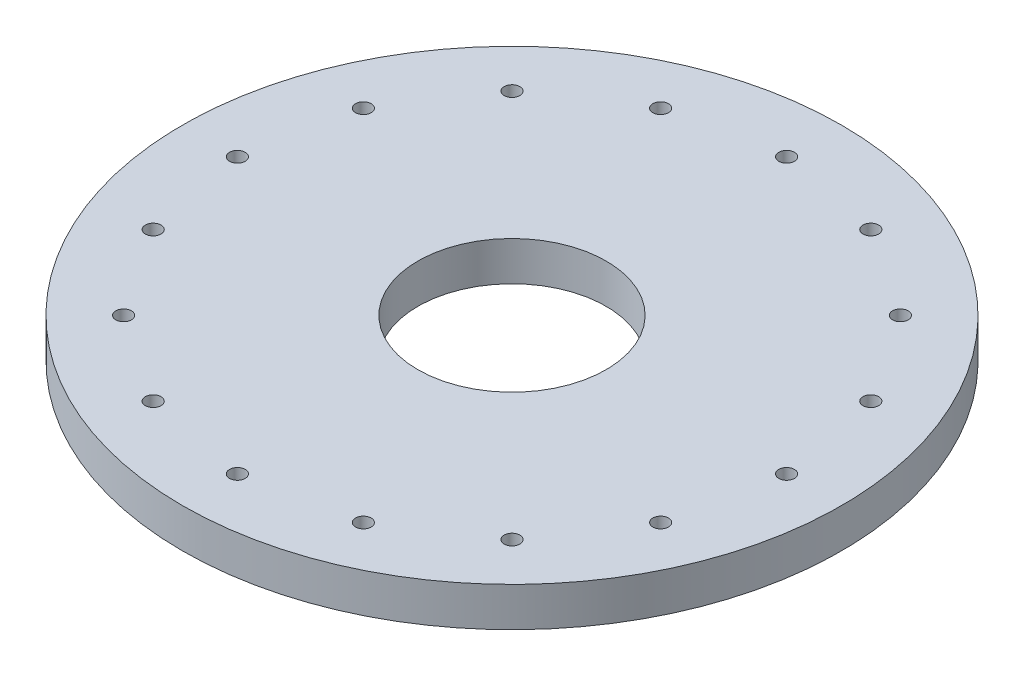
ISO-10303-21;
HEADER;
FILE_DESCRIPTION(('STEP AP214'),'2;1');
FILE_NAME('part.step','',(''),(''),'','','');
FILE_SCHEMA(('AUTOMOTIVE_DESIGN { 1 0 10303 214 1 1 1 1 }'));
ENDSEC;
DATA;
#1=APPLICATION_CONTEXT('core data for automotive mechanical design processes');
#2=APPLICATION_PROTOCOL_DEFINITION('international standard','automotive_design',2000,#1);
#3=PRODUCT_CONTEXT('',#1,'mechanical');
#4=PRODUCT('Part','Part','',(#3));
#5=PRODUCT_RELATED_PRODUCT_CATEGORY('part','',(#4));
#6=PRODUCT_DEFINITION_FORMATION('','',#4);
#7=PRODUCT_DEFINITION_CONTEXT('part definition',#1,'design');
#8=PRODUCT_DEFINITION('design','',#6,#7);
#9=PRODUCT_DEFINITION_SHAPE('','',#8);
#10=(LENGTH_UNIT() NAMED_UNIT(*) SI_UNIT(.MILLI.,.METRE.));
#11=(NAMED_UNIT(*) PLANE_ANGLE_UNIT() SI_UNIT($,.RADIAN.));
#12=(NAMED_UNIT(*) SI_UNIT($,.STERADIAN.) SOLID_ANGLE_UNIT());
#13=UNCERTAINTY_MEASURE_WITH_UNIT(LENGTH_MEASURE(1.E-05),#10,'distance_accuracy_value','');
#14=(GEOMETRIC_REPRESENTATION_CONTEXT(3) GLOBAL_UNCERTAINTY_ASSIGNED_CONTEXT((#13)) GLOBAL_UNIT_ASSIGNED_CONTEXT((#10,
#11,#12)) REPRESENTATION_CONTEXT('',''));
#15=CARTESIAN_POINT('',(0.,0.,0.));
#16=DIRECTION('',(0.,0.,1.));
#17=DIRECTION('',(1.,0.,0.));
#18=AXIS2_PLACEMENT_3D('',#15,#16,#17);
#19=CARTESIAN_POINT('',(0.,5.,0.));
#20=DIRECTION('',(0.,1.,0.));
#21=DIRECTION('',(0.,0.,1.));
#22=AXIS2_PLACEMENT_3D('',#19,#20,#21);
#23=PLANE('',#22);
#24=CARTESIAN_POINT('',(24.7487373415295,5.,-24.7487373415289));
#25=DIRECTION('',(0.,1.,0.));
#26=DIRECTION('',(0.,0.,1.));
#27=AXIS2_PLACEMENT_3D('',#24,#25,#26);
#28=CIRCLE('',#27,1.);
#29=CARTESIAN_POINT('',(24.7487373415295,5.,-23.7487373415289));
#30=VERTEX_POINT('',#29);
#31=EDGE_CURVE('E135',#30,#30,#28,.T.);
#32=ORIENTED_EDGE('',*,*,#31,.F.);
#33=EDGE_LOOP('',(#32));
#34=FACE_BOUND('',#33,.T.);
#35=CARTESIAN_POINT('',(3.66605540578529E-13,5.,-35.));
#36=DIRECTION('',(0.,1.,0.));
#37=DIRECTION('',(0.,0.,1.));
#38=AXIS2_PLACEMENT_3D('',#35,#36,#37);
#39=CIRCLE('',#38,0.999999999999995);
#40=CARTESIAN_POINT('',(3.66605540578529E-13,5.,-34.));
#41=VERTEX_POINT('',#40);
#42=EDGE_CURVE('E123',#41,#41,#39,.T.);
#43=ORIENTED_EDGE('',*,*,#42,.F.);
#44=EDGE_LOOP('',(#43));
#45=FACE_BOUND('',#44,.T.);
#46=CARTESIAN_POINT('',(-24.748737341529,5.,-24.7487373415294));
#47=DIRECTION('',(0.,1.,0.));
#48=DIRECTION('',(0.,0.,1.));
#49=AXIS2_PLACEMENT_3D('',#46,#47,#48);
#50=CIRCLE('',#49,1.);
#51=CARTESIAN_POINT('',(-24.748737341529,5.,-23.7487373415294));
#52=VERTEX_POINT('',#51);
#53=EDGE_CURVE('E111',#52,#52,#50,.T.);
#54=ORIENTED_EDGE('',*,*,#53,.F.);
#55=EDGE_LOOP('',(#54));
#56=FACE_BOUND('',#55,.T.);
#57=CARTESIAN_POINT('',(-35.,5.,-2.44403693719019E-13));
#58=DIRECTION('',(0.,1.,0.));
#59=DIRECTION('',(0.,0.,1.));
#60=AXIS2_PLACEMENT_3D('',#57,#58,#59);
#61=CIRCLE('',#60,0.999999999999996);
#62=CARTESIAN_POINT('',(-35.,5.,0.999999999999752));
#63=VERTEX_POINT('',#62);
#64=EDGE_CURVE('E99',#63,#63,#61,.T.);
#65=ORIENTED_EDGE('',*,*,#64,.F.);
#66=EDGE_LOOP('',(#65));
#67=FACE_BOUND('',#66,.T.);
#68=CARTESIAN_POINT('',(-24.7487373415293,5.,24.748737341529));
#69=DIRECTION('',(0.,1.,0.));
#70=DIRECTION('',(0.,0.,1.));
#71=AXIS2_PLACEMENT_3D('',#68,#69,#70);
#72=CIRCLE('',#71,0.999999999999994);
#73=CARTESIAN_POINT('',(-24.7487373415293,5.,25.748737341529));
#74=VERTEX_POINT('',#73);
#75=EDGE_CURVE('E87',#74,#74,#72,.T.);
#76=ORIENTED_EDGE('',*,*,#75,.F.);
#77=EDGE_LOOP('',(#76));
#78=FACE_BOUND('',#77,.T.);
#79=CARTESIAN_POINT('',(-1.2220184685951E-13,5.,35.));
#80=DIRECTION('',(0.,1.,0.));
#81=DIRECTION('',(0.,0.,1.));
#82=AXIS2_PLACEMENT_3D('',#79,#80,#81);
#83=CIRCLE('',#82,0.999999999999997);
#84=CARTESIAN_POINT('',(-1.2220184685951E-13,5.,36.));
#85=VERTEX_POINT('',#84);
#86=EDGE_CURVE('E75',#85,#85,#83,.T.);
#87=ORIENTED_EDGE('',*,*,#86,.F.);
#88=EDGE_LOOP('',(#87));
#89=FACE_BOUND('',#88,.T.);
#90=CARTESIAN_POINT('',(24.7487373415291,5.,24.7487373415292));
#91=DIRECTION('',(0.,1.,0.));
#92=DIRECTION('',(0.,0.,1.));
#93=AXIS2_PLACEMENT_3D('',#90,#91,#92);
#94=CIRCLE('',#93,0.999999999999997);
#95=CARTESIAN_POINT('',(24.7487373415291,5.,25.7487373415292));
#96=VERTEX_POINT('',#95);
#97=EDGE_CURVE('E63',#96,#96,#94,.T.);
#98=ORIENTED_EDGE('',*,*,#97,.F.);
#99=EDGE_LOOP('',(#98));
#100=FACE_BOUND('',#99,.T.);
#101=CARTESIAN_POINT('',(35.,5.,0.));
#102=DIRECTION('',(0.,1.,0.));
#103=DIRECTION('',(0.,0.,1.));
#104=AXIS2_PLACEMENT_3D('',#101,#102,#103);
#105=CIRCLE('',#104,0.999999999999998);
#106=CARTESIAN_POINT('',(35.,5.,0.999999999999998));
#107=VERTEX_POINT('',#106);
#108=EDGE_CURVE('E51',#107,#107,#105,.T.);
#109=ORIENTED_EDGE('',*,*,#108,.F.);
#110=EDGE_LOOP('',(#109));
#111=FACE_BOUND('',#110,.T.);
#112=CARTESIAN_POINT('',(0.,5.,0.));
#113=DIRECTION('',(0.,1.,0.));
#114=DIRECTION('',(0.,0.,1.));
#115=AXIS2_PLACEMENT_3D('',#112,#113,#114);
#116=CIRCLE('',#115,42.);
#117=CARTESIAN_POINT('',(0.,5.,42.));
#118=VERTEX_POINT('',#117);
#119=EDGE_CURVE('E10',#118,#118,#116,.T.);
#120=ORIENTED_EDGE('',*,*,#119,.T.);
#121=EDGE_LOOP('',(#120));
#122=FACE_BOUND('',#121,.T.);
#123=CARTESIAN_POINT('',(0.,5.,0.));
#124=DIRECTION('',(0.,1.,0.));
#125=DIRECTION('',(0.,0.,1.));
#126=AXIS2_PLACEMENT_3D('',#123,#124,#125);
#127=CIRCLE('',#126,12.);
#128=CARTESIAN_POINT('',(0.,5.,12.));
#129=VERTEX_POINT('',#128);
#130=EDGE_CURVE('E46',#129,#129,#127,.T.);
#131=ORIENTED_EDGE('',*,*,#130,.F.);
#132=EDGE_LOOP('',(#131));
#133=FACE_BOUND('',#132,.T.);
#134=CARTESIAN_POINT('',(32.335783637895,5.,13.3939201327782));
#135=DIRECTION('',(0.,1.,0.));
#136=DIRECTION('',(0.,0.,1.));
#137=AXIS2_PLACEMENT_3D('',#134,#135,#136);
#138=CIRCLE('',#137,0.999999999999994);
#139=CARTESIAN_POINT('',(32.335783637895,5.,14.3939201327782));
#140=VERTEX_POINT('',#139);
#141=EDGE_CURVE('E57',#140,#140,#138,.T.);
#142=ORIENTED_EDGE('',*,*,#141,.F.);
#143=EDGE_LOOP('',(#142));
#144=FACE_BOUND('',#143,.T.);
#145=CARTESIAN_POINT('',(13.3939201327781,5.,32.3357836378951));
#146=DIRECTION('',(0.,1.,0.));
#147=DIRECTION('',(0.,0.,1.));
#148=AXIS2_PLACEMENT_3D('',#145,#146,#147);
#149=CIRCLE('',#148,1.);
#150=CARTESIAN_POINT('',(13.3939201327781,5.,33.3357836378951));
#151=VERTEX_POINT('',#150);
#152=EDGE_CURVE('E69',#151,#151,#149,.T.);
#153=ORIENTED_EDGE('',*,*,#152,.F.);
#154=EDGE_LOOP('',(#153));
#155=FACE_BOUND('',#154,.T.);
#156=CARTESIAN_POINT('',(-13.3939201327783,5.,32.335783637895));
#157=DIRECTION('',(0.,1.,0.));
#158=DIRECTION('',(0.,0.,1.));
#159=AXIS2_PLACEMENT_3D('',#156,#157,#158);
#160=CIRCLE('',#159,1.);
#161=CARTESIAN_POINT('',(-13.3939201327783,5.,33.335783637895));
#162=VERTEX_POINT('',#161);
#163=EDGE_CURVE('E81',#162,#162,#160,.T.);
#164=ORIENTED_EDGE('',*,*,#163,.F.);
#165=EDGE_LOOP('',(#164));
#166=FACE_BOUND('',#165,.T.);
#167=CARTESIAN_POINT('',(-32.3357836378951,5.,13.3939201327779));
#168=DIRECTION('',(0.,1.,0.));
#169=DIRECTION('',(0.,0.,1.));
#170=AXIS2_PLACEMENT_3D('',#167,#168,#169);
#171=CIRCLE('',#170,1.);
#172=CARTESIAN_POINT('',(-32.3357836378951,5.,14.393920132778));
#173=VERTEX_POINT('',#172);
#174=EDGE_CURVE('E93',#173,#173,#171,.T.);
#175=ORIENTED_EDGE('',*,*,#174,.F.);
#176=EDGE_LOOP('',(#175));
#177=FACE_BOUND('',#176,.T.);
#178=CARTESIAN_POINT('',(-32.3357836378949,5.,-13.3939201327784));
#179=DIRECTION('',(0.,1.,0.));
#180=DIRECTION('',(0.,0.,1.));
#181=AXIS2_PLACEMENT_3D('',#178,#179,#180);
#182=CIRCLE('',#181,1.);
#183=CARTESIAN_POINT('',(-32.3357836378949,5.,-12.3939201327784));
#184=VERTEX_POINT('',#183);
#185=EDGE_CURVE('E105',#184,#184,#182,.T.);
#186=ORIENTED_EDGE('',*,*,#185,.F.);
#187=EDGE_LOOP('',(#186));
#188=FACE_BOUND('',#187,.T.);
#189=CARTESIAN_POINT('',(-13.3939201327778,5.,-32.3357836378952));
#190=DIRECTION('',(0.,1.,0.));
#191=DIRECTION('',(0.,0.,1.));
#192=AXIS2_PLACEMENT_3D('',#189,#190,#191);
#193=CIRCLE('',#192,0.999999999999999);
#194=CARTESIAN_POINT('',(-13.3939201327778,5.,-31.3357836378952));
#195=VERTEX_POINT('',#194);
#196=EDGE_CURVE('E117',#195,#195,#193,.T.);
#197=ORIENTED_EDGE('',*,*,#196,.F.);
#198=EDGE_LOOP('',(#197));
#199=FACE_BOUND('',#198,.T.);
#200=CARTESIAN_POINT('',(13.3939201327785,5.,-32.3357836378949));
#201=DIRECTION('',(0.,1.,0.));
#202=DIRECTION('',(0.,0.,1.));
#203=AXIS2_PLACEMENT_3D('',#200,#201,#202);
#204=CIRCLE('',#203,0.999999999999994);
#205=CARTESIAN_POINT('',(13.3939201327785,5.,-31.3357836378949));
#206=VERTEX_POINT('',#205);
#207=EDGE_CURVE('E129',#206,#206,#204,.T.);
#208=ORIENTED_EDGE('',*,*,#207,.F.);
#209=EDGE_LOOP('',(#208));
#210=FACE_BOUND('',#209,.T.);
#211=CARTESIAN_POINT('',(32.3357836378952,5.,-13.3939201327777));
#212=DIRECTION('',(0.,1.,0.));
#213=DIRECTION('',(0.,0.,1.));
#214=AXIS2_PLACEMENT_3D('',#211,#212,#213);
#215=CIRCLE('',#214,0.999999999999998);
#216=CARTESIAN_POINT('',(32.3357836378952,5.,-12.3939201327777));
#217=VERTEX_POINT('',#216);
#218=EDGE_CURVE('E141',#217,#217,#215,.T.);
#219=ORIENTED_EDGE('',*,*,#218,.F.);
#220=EDGE_LOOP('',(#219));
#221=FACE_BOUND('',#220,.T.);
#222=ADVANCED_FACE('F35',(#34,#45,#56,#67,#78,#89,#100,#111,#122,#133,#144,#155,#166,#177,#188,
#199,#210,#221),#23,.T.);
#223=CARTESIAN_POINT('',(0.,0.,0.));
#224=DIRECTION('',(0.,1.,0.));
#225=DIRECTION('',(0.,0.,1.));
#226=AXIS2_PLACEMENT_3D('',#223,#224,#225);
#227=PLANE('',#226);
#228=CARTESIAN_POINT('',(0.,0.,0.));
#229=DIRECTION('',(0.,1.,0.));
#230=DIRECTION('',(0.,0.,1.));
#231=AXIS2_PLACEMENT_3D('',#228,#229,#230);
#232=CIRCLE('',#231,42.);
#233=CARTESIAN_POINT('',(0.,0.,42.));
#234=VERTEX_POINT('',#233);
#235=EDGE_CURVE('E39',#234,#234,#232,.T.);
#236=ORIENTED_EDGE('',*,*,#235,.F.);
#237=EDGE_LOOP('',(#236));
#238=FACE_BOUND('',#237,.T.);
#239=CARTESIAN_POINT('',(0.,0.,0.));
#240=DIRECTION('',(0.,1.,0.));
#241=DIRECTION('',(0.,0.,1.));
#242=AXIS2_PLACEMENT_3D('',#239,#240,#241);
#243=CIRCLE('',#242,12.);
#244=CARTESIAN_POINT('',(0.,0.,12.));
#245=VERTEX_POINT('',#244);
#246=EDGE_CURVE('E48',#245,#245,#243,.T.);
#247=ORIENTED_EDGE('',*,*,#246,.T.);
#248=EDGE_LOOP('',(#247));
#249=FACE_BOUND('',#248,.T.);
#250=CARTESIAN_POINT('',(35.,0.,0.));
#251=DIRECTION('',(0.,1.,0.));
#252=DIRECTION('',(0.,0.,1.));
#253=AXIS2_PLACEMENT_3D('',#250,#251,#252);
#254=CIRCLE('',#253,0.999999999999998);
#255=CARTESIAN_POINT('',(35.,0.,0.999999999999998));
#256=VERTEX_POINT('',#255);
#257=EDGE_CURVE('E54',#256,#256,#254,.T.);
#258=ORIENTED_EDGE('',*,*,#257,.T.);
#259=EDGE_LOOP('',(#258));
#260=FACE_BOUND('',#259,.T.);
#261=CARTESIAN_POINT('',(32.335783637895,0.,13.3939201327782));
#262=DIRECTION('',(0.,1.,0.));
#263=DIRECTION('',(0.,0.,1.));
#264=AXIS2_PLACEMENT_3D('',#261,#262,#263);
#265=CIRCLE('',#264,0.999999999999994);
#266=CARTESIAN_POINT('',(32.335783637895,0.,14.3939201327782));
#267=VERTEX_POINT('',#266);
#268=EDGE_CURVE('E60',#267,#267,#265,.T.);
#269=ORIENTED_EDGE('',*,*,#268,.T.);
#270=EDGE_LOOP('',(#269));
#271=FACE_BOUND('',#270,.T.);
#272=CARTESIAN_POINT('',(24.7487373415291,0.,24.7487373415292));
#273=DIRECTION('',(0.,1.,0.));
#274=DIRECTION('',(0.,0.,1.));
#275=AXIS2_PLACEMENT_3D('',#272,#273,#274);
#276=CIRCLE('',#275,0.999999999999997);
#277=CARTESIAN_POINT('',(24.7487373415291,0.,25.7487373415292));
#278=VERTEX_POINT('',#277);
#279=EDGE_CURVE('E66',#278,#278,#276,.T.);
#280=ORIENTED_EDGE('',*,*,#279,.T.);
#281=EDGE_LOOP('',(#280));
#282=FACE_BOUND('',#281,.T.);
#283=CARTESIAN_POINT('',(13.3939201327781,0.,32.3357836378951));
#284=DIRECTION('',(0.,1.,0.));
#285=DIRECTION('',(0.,0.,1.));
#286=AXIS2_PLACEMENT_3D('',#283,#284,#285);
#287=CIRCLE('',#286,1.);
#288=CARTESIAN_POINT('',(13.3939201327781,0.,33.3357836378951));
#289=VERTEX_POINT('',#288);
#290=EDGE_CURVE('E72',#289,#289,#287,.T.);
#291=ORIENTED_EDGE('',*,*,#290,.T.);
#292=EDGE_LOOP('',(#291));
#293=FACE_BOUND('',#292,.T.);
#294=CARTESIAN_POINT('',(-1.2220184685951E-13,0.,35.));
#295=DIRECTION('',(0.,1.,0.));
#296=DIRECTION('',(0.,0.,1.));
#297=AXIS2_PLACEMENT_3D('',#294,#295,#296);
#298=CIRCLE('',#297,0.999999999999997);
#299=CARTESIAN_POINT('',(-1.2220184685951E-13,0.,36.));
#300=VERTEX_POINT('',#299);
#301=EDGE_CURVE('E78',#300,#300,#298,.T.);
#302=ORIENTED_EDGE('',*,*,#301,.T.);
#303=EDGE_LOOP('',(#302));
#304=FACE_BOUND('',#303,.T.);
#305=CARTESIAN_POINT('',(-13.3939201327783,0.,32.335783637895));
#306=DIRECTION('',(0.,1.,0.));
#307=DIRECTION('',(0.,0.,1.));
#308=AXIS2_PLACEMENT_3D('',#305,#306,#307);
#309=CIRCLE('',#308,1.);
#310=CARTESIAN_POINT('',(-13.3939201327783,0.,33.335783637895));
#311=VERTEX_POINT('',#310);
#312=EDGE_CURVE('E84',#311,#311,#309,.T.);
#313=ORIENTED_EDGE('',*,*,#312,.T.);
#314=EDGE_LOOP('',(#313));
#315=FACE_BOUND('',#314,.T.);
#316=CARTESIAN_POINT('',(-24.7487373415293,0.,24.748737341529));
#317=DIRECTION('',(0.,1.,0.));
#318=DIRECTION('',(0.,0.,1.));
#319=AXIS2_PLACEMENT_3D('',#316,#317,#318);
#320=CIRCLE('',#319,0.999999999999994);
#321=CARTESIAN_POINT('',(-24.7487373415293,0.,25.748737341529));
#322=VERTEX_POINT('',#321);
#323=EDGE_CURVE('E90',#322,#322,#320,.T.);
#324=ORIENTED_EDGE('',*,*,#323,.T.);
#325=EDGE_LOOP('',(#324));
#326=FACE_BOUND('',#325,.T.);
#327=CARTESIAN_POINT('',(-32.3357836378951,0.,13.3939201327779));
#328=DIRECTION('',(0.,1.,0.));
#329=DIRECTION('',(0.,0.,1.));
#330=AXIS2_PLACEMENT_3D('',#327,#328,#329);
#331=CIRCLE('',#330,1.);
#332=CARTESIAN_POINT('',(-32.3357836378951,0.,14.393920132778));
#333=VERTEX_POINT('',#332);
#334=EDGE_CURVE('E96',#333,#333,#331,.T.);
#335=ORIENTED_EDGE('',*,*,#334,.T.);
#336=EDGE_LOOP('',(#335));
#337=FACE_BOUND('',#336,.T.);
#338=CARTESIAN_POINT('',(-35.,0.,-2.44403693719019E-13));
#339=DIRECTION('',(0.,1.,0.));
#340=DIRECTION('',(0.,0.,1.));
#341=AXIS2_PLACEMENT_3D('',#338,#339,#340);
#342=CIRCLE('',#341,0.999999999999996);
#343=CARTESIAN_POINT('',(-35.,0.,0.999999999999752));
#344=VERTEX_POINT('',#343);
#345=EDGE_CURVE('E102',#344,#344,#342,.T.);
#346=ORIENTED_EDGE('',*,*,#345,.T.);
#347=EDGE_LOOP('',(#346));
#348=FACE_BOUND('',#347,.T.);
#349=CARTESIAN_POINT('',(-32.3357836378949,0.,-13.3939201327784));
#350=DIRECTION('',(0.,1.,0.));
#351=DIRECTION('',(0.,0.,1.));
#352=AXIS2_PLACEMENT_3D('',#349,#350,#351);
#353=CIRCLE('',#352,1.);
#354=CARTESIAN_POINT('',(-32.3357836378949,0.,-12.3939201327784));
#355=VERTEX_POINT('',#354);
#356=EDGE_CURVE('E108',#355,#355,#353,.T.);
#357=ORIENTED_EDGE('',*,*,#356,.T.);
#358=EDGE_LOOP('',(#357));
#359=FACE_BOUND('',#358,.T.);
#360=CARTESIAN_POINT('',(-24.748737341529,0.,-24.7487373415294));
#361=DIRECTION('',(0.,1.,0.));
#362=DIRECTION('',(0.,0.,1.));
#363=AXIS2_PLACEMENT_3D('',#360,#361,#362);
#364=CIRCLE('',#363,1.);
#365=CARTESIAN_POINT('',(-24.748737341529,0.,-23.7487373415294));
#366=VERTEX_POINT('',#365);
#367=EDGE_CURVE('E114',#366,#366,#364,.T.);
#368=ORIENTED_EDGE('',*,*,#367,.T.);
#369=EDGE_LOOP('',(#368));
#370=FACE_BOUND('',#369,.T.);
#371=CARTESIAN_POINT('',(-13.3939201327778,0.,-32.3357836378952));
#372=DIRECTION('',(0.,1.,0.));
#373=DIRECTION('',(0.,0.,1.));
#374=AXIS2_PLACEMENT_3D('',#371,#372,#373);
#375=CIRCLE('',#374,0.999999999999999);
#376=CARTESIAN_POINT('',(-13.3939201327778,0.,-31.3357836378952));
#377=VERTEX_POINT('',#376);
#378=EDGE_CURVE('E120',#377,#377,#375,.T.);
#379=ORIENTED_EDGE('',*,*,#378,.T.);
#380=EDGE_LOOP('',(#379));
#381=FACE_BOUND('',#380,.T.);
#382=CARTESIAN_POINT('',(3.66605540578529E-13,0.,-35.));
#383=DIRECTION('',(0.,1.,0.));
#384=DIRECTION('',(0.,0.,1.));
#385=AXIS2_PLACEMENT_3D('',#382,#383,#384);
#386=CIRCLE('',#385,0.999999999999995);
#387=CARTESIAN_POINT('',(3.66605540578529E-13,0.,-34.));
#388=VERTEX_POINT('',#387);
#389=EDGE_CURVE('E126',#388,#388,#386,.T.);
#390=ORIENTED_EDGE('',*,*,#389,.T.);
#391=EDGE_LOOP('',(#390));
#392=FACE_BOUND('',#391,.T.);
#393=CARTESIAN_POINT('',(13.3939201327785,0.,-32.3357836378949));
#394=DIRECTION('',(0.,1.,0.));
#395=DIRECTION('',(0.,0.,1.));
#396=AXIS2_PLACEMENT_3D('',#393,#394,#395);
#397=CIRCLE('',#396,0.999999999999994);
#398=CARTESIAN_POINT('',(13.3939201327785,0.,-31.3357836378949));
#399=VERTEX_POINT('',#398);
#400=EDGE_CURVE('E132',#399,#399,#397,.T.);
#401=ORIENTED_EDGE('',*,*,#400,.T.);
#402=EDGE_LOOP('',(#401));
#403=FACE_BOUND('',#402,.T.);
#404=CARTESIAN_POINT('',(24.7487373415295,0.,-24.7487373415289));
#405=DIRECTION('',(0.,1.,0.));
#406=DIRECTION('',(0.,0.,1.));
#407=AXIS2_PLACEMENT_3D('',#404,#405,#406);
#408=CIRCLE('',#407,1.);
#409=CARTESIAN_POINT('',(24.7487373415295,0.,-23.7487373415289));
#410=VERTEX_POINT('',#409);
#411=EDGE_CURVE('E138',#410,#410,#408,.T.);
#412=ORIENTED_EDGE('',*,*,#411,.T.);
#413=EDGE_LOOP('',(#412));
#414=FACE_BOUND('',#413,.T.);
#415=CARTESIAN_POINT('',(32.3357836378952,0.,-13.3939201327777));
#416=DIRECTION('',(0.,1.,0.));
#417=DIRECTION('',(0.,0.,1.));
#418=AXIS2_PLACEMENT_3D('',#415,#416,#417);
#419=CIRCLE('',#418,0.999999999999998);
#420=CARTESIAN_POINT('',(32.3357836378952,0.,-12.3939201327777));
#421=VERTEX_POINT('',#420);
#422=EDGE_CURVE('E144',#421,#421,#419,.T.);
#423=ORIENTED_EDGE('',*,*,#422,.T.);
#424=EDGE_LOOP('',(#423));
#425=FACE_BOUND('',#424,.T.);
#426=ADVANCED_FACE('F154',(#238,#249,#260,#271,#282,#293,#304,#315,#326,#337,#348,#359,#370,
#381,#392,#403,#414,#425),#227,.F.);
#427=CARTESIAN_POINT('',(0.,5.,0.));
#428=DIRECTION('',(0.,-1.,0.));
#429=DIRECTION('',(0.,0.,-1.));
#430=AXIS2_PLACEMENT_3D('',#427,#428,#429);
#431=CYLINDRICAL_SURFACE('',#430,42.);
#432=ORIENTED_EDGE('',*,*,#119,.F.);
#433=EDGE_LOOP('',(#432));
#434=FACE_BOUND('',#433,.T.);
#435=ORIENTED_EDGE('',*,*,#235,.T.);
#436=EDGE_LOOP('',(#435));
#437=FACE_BOUND('',#436,.T.);
#438=ADVANCED_FACE('F37',(#434,#437),#431,.T.);
#439=CARTESIAN_POINT('',(0.,5.,0.));
#440=DIRECTION('',(0.,-1.,0.));
#441=DIRECTION('',(0.,0.,-1.));
#442=AXIS2_PLACEMENT_3D('',#439,#440,#441);
#443=CYLINDRICAL_SURFACE('',#442,12.);
#444=ORIENTED_EDGE('',*,*,#130,.T.);
#445=EDGE_LOOP('',(#444));
#446=FACE_BOUND('',#445,.T.);
#447=ORIENTED_EDGE('',*,*,#246,.F.);
#448=EDGE_LOOP('',(#447));
#449=FACE_BOUND('',#448,.T.);
#450=ADVANCED_FACE('F164',(#446,#449),#443,.F.);
#451=CARTESIAN_POINT('',(35.,5.,0.));
#452=DIRECTION('',(0.,-1.,0.));
#453=DIRECTION('',(0.,0.,-1.));
#454=AXIS2_PLACEMENT_3D('',#451,#452,#453);
#455=CYLINDRICAL_SURFACE('',#454,0.999999999999998);
#456=ORIENTED_EDGE('',*,*,#108,.T.);
#457=EDGE_LOOP('',(#456));
#458=FACE_BOUND('',#457,.T.);
#459=ORIENTED_EDGE('',*,*,#257,.F.);
#460=EDGE_LOOP('',(#459));
#461=FACE_BOUND('',#460,.T.);
#462=ADVANCED_FACE('F167',(#458,#461),#455,.F.);
#463=CARTESIAN_POINT('',(32.335783637895,5.,13.3939201327782));
#464=DIRECTION('',(0.,-1.,0.));
#465=DIRECTION('',(0.,0.,-1.));
#466=AXIS2_PLACEMENT_3D('',#463,#464,#465);
#467=CYLINDRICAL_SURFACE('',#466,0.999999999999994);
#468=ORIENTED_EDGE('',*,*,#141,.T.);
#469=EDGE_LOOP('',(#468));
#470=FACE_BOUND('',#469,.T.);
#471=ORIENTED_EDGE('',*,*,#268,.F.);
#472=EDGE_LOOP('',(#471));
#473=FACE_BOUND('',#472,.T.);
#474=ADVANCED_FACE('F171',(#470,#473),#467,.F.);
#475=CARTESIAN_POINT('',(24.7487373415291,5.,24.7487373415292));
#476=DIRECTION('',(0.,-1.,0.));
#477=DIRECTION('',(0.,0.,-1.));
#478=AXIS2_PLACEMENT_3D('',#475,#476,#477);
#479=CYLINDRICAL_SURFACE('',#478,0.999999999999997);
#480=ORIENTED_EDGE('',*,*,#97,.T.);
#481=EDGE_LOOP('',(#480));
#482=FACE_BOUND('',#481,.T.);
#483=ORIENTED_EDGE('',*,*,#279,.F.);
#484=EDGE_LOOP('',(#483));
#485=FACE_BOUND('',#484,.T.);
#486=ADVANCED_FACE('F175',(#482,#485),#479,.F.);
#487=CARTESIAN_POINT('',(13.3939201327781,5.,32.3357836378951));
#488=DIRECTION('',(0.,-1.,0.));
#489=DIRECTION('',(0.,0.,-1.));
#490=AXIS2_PLACEMENT_3D('',#487,#488,#489);
#491=CYLINDRICAL_SURFACE('',#490,1.);
#492=ORIENTED_EDGE('',*,*,#152,.T.);
#493=EDGE_LOOP('',(#492));
#494=FACE_BOUND('',#493,.T.);
#495=ORIENTED_EDGE('',*,*,#290,.F.);
#496=EDGE_LOOP('',(#495));
#497=FACE_BOUND('',#496,.T.);
#498=ADVANCED_FACE('F179',(#494,#497),#491,.F.);
#499=CARTESIAN_POINT('',(-1.2220184685951E-13,5.,35.));
#500=DIRECTION('',(0.,-1.,0.));
#501=DIRECTION('',(0.,0.,-1.));
#502=AXIS2_PLACEMENT_3D('',#499,#500,#501);
#503=CYLINDRICAL_SURFACE('',#502,0.999999999999997);
#504=ORIENTED_EDGE('',*,*,#86,.T.);
#505=EDGE_LOOP('',(#504));
#506=FACE_BOUND('',#505,.T.);
#507=ORIENTED_EDGE('',*,*,#301,.F.);
#508=EDGE_LOOP('',(#507));
#509=FACE_BOUND('',#508,.T.);
#510=ADVANCED_FACE('F183',(#506,#509),#503,.F.);
#511=CARTESIAN_POINT('',(-13.3939201327783,5.,32.335783637895));
#512=DIRECTION('',(0.,-1.,0.));
#513=DIRECTION('',(0.,0.,-1.));
#514=AXIS2_PLACEMENT_3D('',#511,#512,#513);
#515=CYLINDRICAL_SURFACE('',#514,1.);
#516=ORIENTED_EDGE('',*,*,#163,.T.);
#517=EDGE_LOOP('',(#516));
#518=FACE_BOUND('',#517,.T.);
#519=ORIENTED_EDGE('',*,*,#312,.F.);
#520=EDGE_LOOP('',(#519));
#521=FACE_BOUND('',#520,.T.);
#522=ADVANCED_FACE('F187',(#518,#521),#515,.F.);
#523=CARTESIAN_POINT('',(-24.7487373415293,5.,24.748737341529));
#524=DIRECTION('',(0.,-1.,0.));
#525=DIRECTION('',(0.,0.,-1.));
#526=AXIS2_PLACEMENT_3D('',#523,#524,#525);
#527=CYLINDRICAL_SURFACE('',#526,0.999999999999994);
#528=ORIENTED_EDGE('',*,*,#75,.T.);
#529=EDGE_LOOP('',(#528));
#530=FACE_BOUND('',#529,.T.);
#531=ORIENTED_EDGE('',*,*,#323,.F.);
#532=EDGE_LOOP('',(#531));
#533=FACE_BOUND('',#532,.T.);
#534=ADVANCED_FACE('F191',(#530,#533),#527,.F.);
#535=CARTESIAN_POINT('',(-32.3357836378951,5.,13.3939201327779));
#536=DIRECTION('',(0.,-1.,0.));
#537=DIRECTION('',(0.,0.,-1.));
#538=AXIS2_PLACEMENT_3D('',#535,#536,#537);
#539=CYLINDRICAL_SURFACE('',#538,1.);
#540=ORIENTED_EDGE('',*,*,#174,.T.);
#541=EDGE_LOOP('',(#540));
#542=FACE_BOUND('',#541,.T.);
#543=ORIENTED_EDGE('',*,*,#334,.F.);
#544=EDGE_LOOP('',(#543));
#545=FACE_BOUND('',#544,.T.);
#546=ADVANCED_FACE('F195',(#542,#545),#539,.F.);
#547=CARTESIAN_POINT('',(-35.,5.,-2.44403693719019E-13));
#548=DIRECTION('',(0.,-1.,0.));
#549=DIRECTION('',(0.,0.,-1.));
#550=AXIS2_PLACEMENT_3D('',#547,#548,#549);
#551=CYLINDRICAL_SURFACE('',#550,0.999999999999996);
#552=ORIENTED_EDGE('',*,*,#64,.T.);
#553=EDGE_LOOP('',(#552));
#554=FACE_BOUND('',#553,.T.);
#555=ORIENTED_EDGE('',*,*,#345,.F.);
#556=EDGE_LOOP('',(#555));
#557=FACE_BOUND('',#556,.T.);
#558=ADVANCED_FACE('F199',(#554,#557),#551,.F.);
#559=CARTESIAN_POINT('',(-32.3357836378949,5.,-13.3939201327784));
#560=DIRECTION('',(0.,-1.,0.));
#561=DIRECTION('',(0.,0.,-1.));
#562=AXIS2_PLACEMENT_3D('',#559,#560,#561);
#563=CYLINDRICAL_SURFACE('',#562,1.);
#564=ORIENTED_EDGE('',*,*,#185,.T.);
#565=EDGE_LOOP('',(#564));
#566=FACE_BOUND('',#565,.T.);
#567=ORIENTED_EDGE('',*,*,#356,.F.);
#568=EDGE_LOOP('',(#567));
#569=FACE_BOUND('',#568,.T.);
#570=ADVANCED_FACE('F203',(#566,#569),#563,.F.);
#571=CARTESIAN_POINT('',(-24.748737341529,5.,-24.7487373415294));
#572=DIRECTION('',(0.,-1.,0.));
#573=DIRECTION('',(0.,0.,-1.));
#574=AXIS2_PLACEMENT_3D('',#571,#572,#573);
#575=CYLINDRICAL_SURFACE('',#574,1.);
#576=ORIENTED_EDGE('',*,*,#53,.T.);
#577=EDGE_LOOP('',(#576));
#578=FACE_BOUND('',#577,.T.);
#579=ORIENTED_EDGE('',*,*,#367,.F.);
#580=EDGE_LOOP('',(#579));
#581=FACE_BOUND('',#580,.T.);
#582=ADVANCED_FACE('F207',(#578,#581),#575,.F.);
#583=CARTESIAN_POINT('',(-13.3939201327778,5.,-32.3357836378952));
#584=DIRECTION('',(0.,-1.,0.));
#585=DIRECTION('',(0.,0.,-1.));
#586=AXIS2_PLACEMENT_3D('',#583,#584,#585);
#587=CYLINDRICAL_SURFACE('',#586,0.999999999999999);
#588=ORIENTED_EDGE('',*,*,#196,.T.);
#589=EDGE_LOOP('',(#588));
#590=FACE_BOUND('',#589,.T.);
#591=ORIENTED_EDGE('',*,*,#378,.F.);
#592=EDGE_LOOP('',(#591));
#593=FACE_BOUND('',#592,.T.);
#594=ADVANCED_FACE('F211',(#590,#593),#587,.F.);
#595=CARTESIAN_POINT('',(3.66605540578529E-13,5.,-35.));
#596=DIRECTION('',(0.,-1.,0.));
#597=DIRECTION('',(0.,0.,-1.));
#598=AXIS2_PLACEMENT_3D('',#595,#596,#597);
#599=CYLINDRICAL_SURFACE('',#598,0.999999999999995);
#600=ORIENTED_EDGE('',*,*,#42,.T.);
#601=EDGE_LOOP('',(#600));
#602=FACE_BOUND('',#601,.T.);
#603=ORIENTED_EDGE('',*,*,#389,.F.);
#604=EDGE_LOOP('',(#603));
#605=FACE_BOUND('',#604,.T.);
#606=ADVANCED_FACE('F215',(#602,#605),#599,.F.);
#607=CARTESIAN_POINT('',(13.3939201327785,5.,-32.3357836378949));
#608=DIRECTION('',(0.,-1.,0.));
#609=DIRECTION('',(0.,0.,-1.));
#610=AXIS2_PLACEMENT_3D('',#607,#608,#609);
#611=CYLINDRICAL_SURFACE('',#610,0.999999999999994);
#612=ORIENTED_EDGE('',*,*,#207,.T.);
#613=EDGE_LOOP('',(#612));
#614=FACE_BOUND('',#613,.T.);
#615=ORIENTED_EDGE('',*,*,#400,.F.);
#616=EDGE_LOOP('',(#615));
#617=FACE_BOUND('',#616,.T.);
#618=ADVANCED_FACE('F219',(#614,#617),#611,.F.);
#619=CARTESIAN_POINT('',(24.7487373415295,5.,-24.7487373415289));
#620=DIRECTION('',(0.,-1.,0.));
#621=DIRECTION('',(0.,0.,-1.));
#622=AXIS2_PLACEMENT_3D('',#619,#620,#621);
#623=CYLINDRICAL_SURFACE('',#622,1.);
#624=ORIENTED_EDGE('',*,*,#31,.T.);
#625=EDGE_LOOP('',(#624));
#626=FACE_BOUND('',#625,.T.);
#627=ORIENTED_EDGE('',*,*,#411,.F.);
#628=EDGE_LOOP('',(#627));
#629=FACE_BOUND('',#628,.T.);
#630=ADVANCED_FACE('F223',(#626,#629),#623,.F.);
#631=CARTESIAN_POINT('',(32.3357836378952,5.,-13.3939201327777));
#632=DIRECTION('',(0.,-1.,0.));
#633=DIRECTION('',(0.,0.,-1.));
#634=AXIS2_PLACEMENT_3D('',#631,#632,#633);
#635=CYLINDRICAL_SURFACE('',#634,0.999999999999998);
#636=ORIENTED_EDGE('',*,*,#218,.T.);
#637=EDGE_LOOP('',(#636));
#638=FACE_BOUND('',#637,.T.);
#639=ORIENTED_EDGE('',*,*,#422,.F.);
#640=EDGE_LOOP('',(#639));
#641=FACE_BOUND('',#640,.T.);
#642=ADVANCED_FACE('F150',(#638,#641),#635,.F.);
#643=CLOSED_SHELL('',(#222,#426,#438,#450,#462,#474,#486,#498,#510,#522,#534,#546,#558,#570,
#582,#594,#606,#618,#630,#642));
#644=MANIFOLD_SOLID_BREP('B2',#643);
#645=ADVANCED_BREP_SHAPE_REPRESENTATION('',(#18,#644),#14);
#646=SHAPE_DEFINITION_REPRESENTATION(#9,#645);
ENDSEC;
END-ISO-10303-21;
